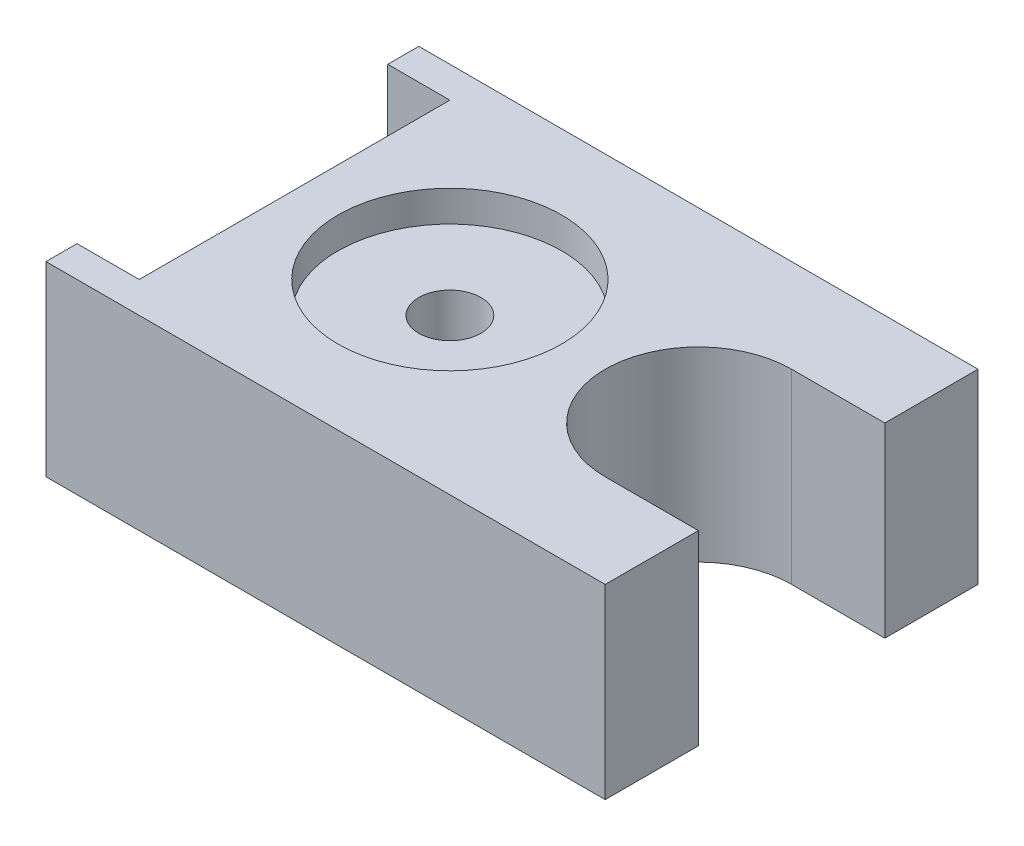
ISO-10303-21;
HEADER;
FILE_DESCRIPTION(('STEP AP214'),'2;1');
FILE_NAME('part.step','',(''),(''),'','','');
FILE_SCHEMA(('AUTOMOTIVE_DESIGN { 1 0 10303 214 1 1 1 1 }'));
ENDSEC;
DATA;
#1=APPLICATION_CONTEXT('core data for automotive mechanical design processes');
#2=APPLICATION_PROTOCOL_DEFINITION('international standard','automotive_design',2000,#1);
#3=PRODUCT_CONTEXT('',#1,'mechanical');
#4=PRODUCT('Part','Part','',(#3));
#5=PRODUCT_RELATED_PRODUCT_CATEGORY('part','',(#4));
#6=PRODUCT_DEFINITION_FORMATION('','',#4);
#7=PRODUCT_DEFINITION_CONTEXT('part definition',#1,'design');
#8=PRODUCT_DEFINITION('design','',#6,#7);
#9=PRODUCT_DEFINITION_SHAPE('','',#8);
#10=(LENGTH_UNIT() NAMED_UNIT(*) SI_UNIT(.MILLI.,.METRE.));
#11=(NAMED_UNIT(*) PLANE_ANGLE_UNIT() SI_UNIT($,.RADIAN.));
#12=(NAMED_UNIT(*) SI_UNIT($,.STERADIAN.) SOLID_ANGLE_UNIT());
#13=UNCERTAINTY_MEASURE_WITH_UNIT(LENGTH_MEASURE(1.E-05),#10,'distance_accuracy_value','');
#14=(GEOMETRIC_REPRESENTATION_CONTEXT(3) GLOBAL_UNCERTAINTY_ASSIGNED_CONTEXT((#13)) GLOBAL_UNIT_ASSIGNED_CONTEXT((#10,
#11,#12)) REPRESENTATION_CONTEXT('',''));
#15=CARTESIAN_POINT('',(0.,0.,0.));
#16=DIRECTION('',(0.,0.,1.));
#17=DIRECTION('',(1.,0.,0.));
#18=AXIS2_PLACEMENT_3D('',#15,#16,#17);
#19=CARTESIAN_POINT('',(35.,0.,-30.));
#20=DIRECTION('',(0.,1.,0.));
#21=DIRECTION('',(0.,0.,1.));
#22=AXIS2_PLACEMENT_3D('',#19,#20,#21);
#23=CYLINDRICAL_SURFACE('',#22,5.);
#24=CARTESIAN_POINT('',(35.,0.,-30.));
#25=DIRECTION('',(0.,1.,0.));
#26=DIRECTION('',(0.,0.,1.));
#27=AXIS2_PLACEMENT_3D('',#24,#25,#26);
#28=CIRCLE('',#27,5.);
#29=CARTESIAN_POINT('',(35.,0.,-25.));
#30=VERTEX_POINT('',#29);
#31=EDGE_CURVE('E232',#30,#30,#28,.T.);
#32=ORIENTED_EDGE('',*,*,#31,.F.);
#33=EDGE_LOOP('',(#32));
#34=FACE_BOUND('',#33,.T.);
#35=CARTESIAN_POINT('',(35.,25.,-30.));
#36=DIRECTION('',(0.,1.,0.));
#37=DIRECTION('',(0.,0.,1.));
#38=AXIS2_PLACEMENT_3D('',#35,#36,#37);
#39=CIRCLE('',#38,5.);
#40=CARTESIAN_POINT('',(35.,25.,-25.));
#41=VERTEX_POINT('',#40);
#42=EDGE_CURVE('E37',#41,#41,#39,.F.);
#43=ORIENTED_EDGE('',*,*,#42,.F.);
#44=EDGE_LOOP('',(#43));
#45=FACE_BOUND('',#44,.T.);
#46=ADVANCED_FACE('F33',(#34,#45),#23,.F.);
#47=CARTESIAN_POINT('',(0.,30.,-60.));
#48=DIRECTION('',(1.,0.,0.));
#49=DIRECTION('',(0.,0.,-1.));
#50=AXIS2_PLACEMENT_3D('',#47,#48,#49);
#51=PLANE('',#50);
#52=DIRECTION('',(0.,0.,1.));
#53=VECTOR('',#52,1.);
#54=CARTESIAN_POINT('',(0.,30.,-60.));
#55=LINE('',#54,#53);
#56=CARTESIAN_POINT('',(0.,30.,-5.));
#57=VERTEX_POINT('',#56);
#58=CARTESIAN_POINT('',(0.,30.,0.));
#59=VERTEX_POINT('',#58);
#60=EDGE_CURVE('E178',#57,#59,#55,.T.);
#61=ORIENTED_EDGE('',*,*,#60,.F.);
#62=DIRECTION('',(0.,1.,0.));
#63=VECTOR('',#62,1.);
#64=CARTESIAN_POINT('',(0.,0.,-5.));
#65=LINE('',#64,#63);
#66=CARTESIAN_POINT('',(0.,0.,-5.));
#67=VERTEX_POINT('',#66);
#68=EDGE_CURVE('E138',#67,#57,#65,.T.);
#69=ORIENTED_EDGE('',*,*,#68,.F.);
#70=DIRECTION('',(0.,0.,1.));
#71=VECTOR('',#70,1.);
#72=CARTESIAN_POINT('',(0.,0.,-60.));
#73=LINE('',#72,#71);
#74=CARTESIAN_POINT('',(0.,0.,0.));
#75=VERTEX_POINT('',#74);
#76=EDGE_CURVE('E170',#67,#75,#73,.T.);
#77=ORIENTED_EDGE('',*,*,#76,.T.);
#78=DIRECTION('',(0.,-1.,0.));
#79=VECTOR('',#78,1.);
#80=CARTESIAN_POINT('',(0.,30.,0.));
#81=LINE('',#80,#79);
#82=EDGE_CURVE('E11',#59,#75,#81,.T.);
#83=ORIENTED_EDGE('',*,*,#82,.F.);
#84=EDGE_LOOP('',(#61,#69,#77,#83));
#85=FACE_BOUND('',#84,.T.);
#86=ADVANCED_FACE('F224',(#85),#51,.F.);
#87=CARTESIAN_POINT('',(90.,30.,0.));
#88=DIRECTION('',(-1.,0.,0.));
#89=DIRECTION('',(0.,0.,1.));
#90=AXIS2_PLACEMENT_3D('',#87,#88,#89);
#91=PLANE('',#90);
#92=DIRECTION('',(0.,0.,-1.));
#93=VECTOR('',#92,1.);
#94=CARTESIAN_POINT('',(90.,0.,0.));
#95=LINE('',#94,#93);
#96=CARTESIAN_POINT('',(90.,0.,0.));
#97=VERTEX_POINT('',#96);
#98=CARTESIAN_POINT('',(90.,0.,-15.));
#99=VERTEX_POINT('',#98);
#100=EDGE_CURVE('E193',#97,#99,#95,.T.);
#101=ORIENTED_EDGE('',*,*,#100,.T.);
#102=DIRECTION('',(0.,1.,0.));
#103=VECTOR('',#102,1.);
#104=CARTESIAN_POINT('',(90.,0.,-15.));
#105=LINE('',#104,#103);
#106=CARTESIAN_POINT('',(90.,30.,-15.));
#107=VERTEX_POINT('',#106);
#108=EDGE_CURVE('E167',#99,#107,#105,.T.);
#109=ORIENTED_EDGE('',*,*,#108,.T.);
#110=DIRECTION('',(0.,0.,-1.));
#111=VECTOR('',#110,1.);
#112=CARTESIAN_POINT('',(90.,30.,0.));
#113=LINE('',#112,#111);
#114=CARTESIAN_POINT('',(90.,30.,0.));
#115=VERTEX_POINT('',#114);
#116=EDGE_CURVE('E181',#115,#107,#113,.T.);
#117=ORIENTED_EDGE('',*,*,#116,.F.);
#118=DIRECTION('',(0.,-1.,0.));
#119=VECTOR('',#118,1.);
#120=CARTESIAN_POINT('',(90.,30.,0.));
#121=LINE('',#120,#119);
#122=EDGE_CURVE('E42',#115,#97,#121,.T.);
#123=ORIENTED_EDGE('',*,*,#122,.T.);
#124=EDGE_LOOP('',(#101,#109,#117,#123));
#125=FACE_BOUND('',#124,.T.);
#126=ADVANCED_FACE('F208',(#125),#91,.F.);
#127=CARTESIAN_POINT('',(0.,0.,-60.));
#128=VERTEX_POINT('',#127);
#129=CARTESIAN_POINT('',(0.,0.,-55.));
#130=VERTEX_POINT('',#129);
#131=EDGE_CURVE('E187',#128,#130,#73,.T.);
#132=ORIENTED_EDGE('',*,*,#131,.T.);
#133=DIRECTION('',(0.,-1.,0.));
#134=VECTOR('',#133,1.);
#135=CARTESIAN_POINT('',(0.,30.,-55.));
#136=LINE('',#135,#134);
#137=CARTESIAN_POINT('',(0.,30.,-55.));
#138=VERTEX_POINT('',#137);
#139=EDGE_CURVE('E231',#138,#130,#136,.T.);
#140=ORIENTED_EDGE('',*,*,#139,.F.);
#141=CARTESIAN_POINT('',(0.,30.,-60.));
#142=VERTEX_POINT('',#141);
#143=EDGE_CURVE('E143',#142,#138,#55,.T.);
#144=ORIENTED_EDGE('',*,*,#143,.F.);
#145=DIRECTION('',(0.,-1.,0.));
#146=VECTOR('',#145,1.);
#147=CARTESIAN_POINT('',(0.,30.,-60.));
#148=LINE('',#147,#146);
#149=EDGE_CURVE('E186',#142,#128,#148,.T.);
#150=ORIENTED_EDGE('',*,*,#149,.T.);
#151=EDGE_LOOP('',(#132,#140,#144,#150));
#152=FACE_BOUND('',#151,.T.);
#153=ADVANCED_FACE('F35',(#152),#51,.F.);
#154=CARTESIAN_POINT('',(0.,30.,0.));
#155=DIRECTION('',(0.,0.,-1.));
#156=DIRECTION('',(-1.,0.,0.));
#157=AXIS2_PLACEMENT_3D('',#154,#155,#156);
#158=PLANE('',#157);
#159=DIRECTION('',(1.,0.,0.));
#160=VECTOR('',#159,1.);
#161=CARTESIAN_POINT('',(0.,0.,0.));
#162=LINE('',#161,#160);
#163=EDGE_CURVE('E190',#75,#97,#162,.T.);
#164=ORIENTED_EDGE('',*,*,#163,.T.);
#165=ORIENTED_EDGE('',*,*,#122,.F.);
#166=DIRECTION('',(1.,0.,0.));
#167=VECTOR('',#166,1.);
#168=CARTESIAN_POINT('',(0.,30.,0.));
#169=LINE('',#168,#167);
#170=EDGE_CURVE('E177',#59,#115,#169,.T.);
#171=ORIENTED_EDGE('',*,*,#170,.F.);
#172=ORIENTED_EDGE('',*,*,#82,.T.);
#173=EDGE_LOOP('',(#164,#165,#171,#172));
#174=FACE_BOUND('',#173,.T.);
#175=ADVANCED_FACE('F222',(#174),#158,.F.);
#176=CARTESIAN_POINT('',(90.,30.,-45.));
#177=VERTEX_POINT('',#176);
#178=CARTESIAN_POINT('',(90.,30.,-60.));
#179=VERTEX_POINT('',#178);
#180=EDGE_CURVE('E180',#177,#179,#113,.T.);
#181=ORIENTED_EDGE('',*,*,#180,.F.);
#182=DIRECTION('',(0.,1.,0.));
#183=VECTOR('',#182,1.);
#184=CARTESIAN_POINT('',(90.,0.,-45.));
#185=LINE('',#184,#183);
#186=CARTESIAN_POINT('',(90.,0.,-45.));
#187=VERTEX_POINT('',#186);
#188=EDGE_CURVE('E158',#187,#177,#185,.T.);
#189=ORIENTED_EDGE('',*,*,#188,.F.);
#190=CARTESIAN_POINT('',(90.,0.,-60.));
#191=VERTEX_POINT('',#190);
#192=EDGE_CURVE('E192',#187,#191,#95,.T.);
#193=ORIENTED_EDGE('',*,*,#192,.T.);
#194=DIRECTION('',(0.,-1.,0.));
#195=VECTOR('',#194,1.);
#196=CARTESIAN_POINT('',(90.,30.,-60.));
#197=LINE('',#196,#195);
#198=EDGE_CURVE('E200',#179,#191,#197,.T.);
#199=ORIENTED_EDGE('',*,*,#198,.F.);
#200=EDGE_LOOP('',(#181,#189,#193,#199));
#201=FACE_BOUND('',#200,.T.);
#202=ADVANCED_FACE('F285',(#201),#91,.F.);
#203=CARTESIAN_POINT('',(90.,30.,-60.));
#204=DIRECTION('',(0.,0.,1.));
#205=DIRECTION('',(1.,0.,0.));
#206=AXIS2_PLACEMENT_3D('',#203,#204,#205);
#207=PLANE('',#206);
#208=DIRECTION('',(-1.,0.,0.));
#209=VECTOR('',#208,1.);
#210=CARTESIAN_POINT('',(90.,0.,-60.));
#211=LINE('',#210,#209);
#212=EDGE_CURVE('E196',#191,#128,#211,.T.);
#213=ORIENTED_EDGE('',*,*,#212,.T.);
#214=ORIENTED_EDGE('',*,*,#149,.F.);
#215=DIRECTION('',(-1.,0.,0.));
#216=VECTOR('',#215,1.);
#217=CARTESIAN_POINT('',(90.,30.,-60.));
#218=LINE('',#217,#216);
#219=EDGE_CURVE('E184',#179,#142,#218,.T.);
#220=ORIENTED_EDGE('',*,*,#219,.F.);
#221=ORIENTED_EDGE('',*,*,#198,.T.);
#222=EDGE_LOOP('',(#213,#214,#220,#221));
#223=FACE_BOUND('',#222,.T.);
#224=ADVANCED_FACE('F278',(#223),#207,.F.);
#225=CARTESIAN_POINT('',(0.,30.,0.));
#226=DIRECTION('',(0.,1.,0.));
#227=DIRECTION('',(0.,0.,1.));
#228=AXIS2_PLACEMENT_3D('',#225,#226,#227);
#229=PLANE('',#228);
#230=CARTESIAN_POINT('',(35.,30.,-30.));
#231=DIRECTION('',(0.,1.,0.));
#232=DIRECTION('',(0.,0.,1.));
#233=AXIS2_PLACEMENT_3D('',#230,#231,#232);
#234=CIRCLE('',#233,18.);
#235=CARTESIAN_POINT('',(35.,30.,-12.));
#236=VERTEX_POINT('',#235);
#237=EDGE_CURVE('E237',#236,#236,#234,.T.);
#238=ORIENTED_EDGE('',*,*,#237,.F.);
#239=EDGE_LOOP('',(#238));
#240=FACE_BOUND('',#239,.T.);
#241=DIRECTION('',(-1.,0.,0.));
#242=VECTOR('',#241,1.);
#243=CARTESIAN_POINT('',(9.99999999999999,30.,-5.));
#244=LINE('',#243,#242);
#245=CARTESIAN_POINT('',(9.99999999999999,30.,-5.));
#246=VERTEX_POINT('',#245);
#247=EDGE_CURVE('E163',#246,#57,#244,.T.);
#248=ORIENTED_EDGE('',*,*,#247,.T.);
#249=ORIENTED_EDGE('',*,*,#60,.T.);
#250=ORIENTED_EDGE('',*,*,#170,.T.);
#251=ORIENTED_EDGE('',*,*,#116,.T.);
#252=DIRECTION('',(1.,0.,0.));
#253=VECTOR('',#252,1.);
#254=CARTESIAN_POINT('',(75.,30.,-15.));
#255=LINE('',#254,#253);
#256=CARTESIAN_POINT('',(75.,30.,-15.));
#257=VERTEX_POINT('',#256);
#258=EDGE_CURVE('E153',#257,#107,#255,.T.);
#259=ORIENTED_EDGE('',*,*,#258,.F.);
#260=CARTESIAN_POINT('',(75.,30.,-30.));
#261=DIRECTION('',(0.,1.,0.));
#262=DIRECTION('',(0.,0.,1.));
#263=AXIS2_PLACEMENT_3D('',#260,#261,#262);
#264=CIRCLE('',#263,15.);
#265=CARTESIAN_POINT('',(75.,30.,-45.));
#266=VERTEX_POINT('',#265);
#267=EDGE_CURVE('E162',#266,#257,#264,.T.);
#268=ORIENTED_EDGE('',*,*,#267,.F.);
#269=DIRECTION('',(-1.,0.,0.));
#270=VECTOR('',#269,1.);
#271=CARTESIAN_POINT('',(90.,30.,-45.));
#272=LINE('',#271,#270);
#273=EDGE_CURVE('E159',#177,#266,#272,.T.);
#274=ORIENTED_EDGE('',*,*,#273,.F.);
#275=ORIENTED_EDGE('',*,*,#180,.T.);
#276=ORIENTED_EDGE('',*,*,#219,.T.);
#277=ORIENTED_EDGE('',*,*,#143,.T.);
#278=DIRECTION('',(-1.,0.,0.));
#279=VECTOR('',#278,1.);
#280=CARTESIAN_POINT('',(9.99999999999999,30.,-55.));
#281=LINE('',#280,#279);
#282=CARTESIAN_POINT('',(9.99999999999999,30.,-55.));
#283=VERTEX_POINT('',#282);
#284=EDGE_CURVE('E123',#283,#138,#281,.T.);
#285=ORIENTED_EDGE('',*,*,#284,.F.);
#286=DIRECTION('',(0.,0.,-1.));
#287=VECTOR('',#286,1.);
#288=CARTESIAN_POINT('',(9.99999999999999,30.,-5.));
#289=LINE('',#288,#287);
#290=EDGE_CURVE('E129',#246,#283,#289,.T.);
#291=ORIENTED_EDGE('',*,*,#290,.F.);
#292=EDGE_LOOP('',(#248,#249,#250,#251,#259,#268,#274,#275,#276,#277,#285,#291));
#293=FACE_BOUND('',#292,.T.);
#294=ADVANCED_FACE('F141',(#240,#293),#229,.T.);
#295=CARTESIAN_POINT('',(0.,0.,0.));
#296=DIRECTION('',(0.,1.,0.));
#297=DIRECTION('',(0.,0.,1.));
#298=AXIS2_PLACEMENT_3D('',#295,#296,#297);
#299=PLANE('',#298);
#300=ORIENTED_EDGE('',*,*,#31,.T.);
#301=EDGE_LOOP('',(#300));
#302=FACE_BOUND('',#301,.T.);
#303=ORIENTED_EDGE('',*,*,#76,.F.);
#304=DIRECTION('',(-1.,0.,0.));
#305=VECTOR('',#304,1.);
#306=CARTESIAN_POINT('',(9.99999999999999,0.,-5.));
#307=LINE('',#306,#305);
#308=CARTESIAN_POINT('',(9.99999999999999,0.,-5.));
#309=VERTEX_POINT('',#308);
#310=EDGE_CURVE('E145',#309,#67,#307,.T.);
#311=ORIENTED_EDGE('',*,*,#310,.F.);
#312=DIRECTION('',(0.,0.,1.));
#313=VECTOR('',#312,1.);
#314=CARTESIAN_POINT('',(9.99999999999999,0.,-55.));
#315=LINE('',#314,#313);
#316=CARTESIAN_POINT('',(9.99999999999999,0.,-55.));
#317=VERTEX_POINT('',#316);
#318=EDGE_CURVE('E128',#317,#309,#315,.T.);
#319=ORIENTED_EDGE('',*,*,#318,.F.);
#320=DIRECTION('',(-1.,0.,0.));
#321=VECTOR('',#320,1.);
#322=CARTESIAN_POINT('',(9.99999999999999,0.,-55.));
#323=LINE('',#322,#321);
#324=EDGE_CURVE('E126',#317,#130,#323,.T.);
#325=ORIENTED_EDGE('',*,*,#324,.T.);
#326=ORIENTED_EDGE('',*,*,#131,.F.);
#327=ORIENTED_EDGE('',*,*,#212,.F.);
#328=ORIENTED_EDGE('',*,*,#192,.F.);
#329=DIRECTION('',(-1.,0.,0.));
#330=VECTOR('',#329,1.);
#331=CARTESIAN_POINT('',(90.,0.,-45.));
#332=LINE('',#331,#330);
#333=CARTESIAN_POINT('',(75.,0.,-45.));
#334=VERTEX_POINT('',#333);
#335=EDGE_CURVE('E150',#187,#334,#332,.T.);
#336=ORIENTED_EDGE('',*,*,#335,.T.);
#337=CARTESIAN_POINT('',(75.,0.,-30.));
#338=DIRECTION('',(0.,1.,0.));
#339=DIRECTION('',(0.,0.,1.));
#340=AXIS2_PLACEMENT_3D('',#337,#338,#339);
#341=CIRCLE('',#340,15.);
#342=CARTESIAN_POINT('',(75.,0.,-15.));
#343=VERTEX_POINT('',#342);
#344=EDGE_CURVE('E57',#334,#343,#341,.T.);
#345=ORIENTED_EDGE('',*,*,#344,.T.);
#346=DIRECTION('',(1.,0.,0.));
#347=VECTOR('',#346,1.);
#348=CARTESIAN_POINT('',(75.,0.,-15.));
#349=LINE('',#348,#347);
#350=EDGE_CURVE('E155',#343,#99,#349,.T.);
#351=ORIENTED_EDGE('',*,*,#350,.T.);
#352=ORIENTED_EDGE('',*,*,#100,.F.);
#353=ORIENTED_EDGE('',*,*,#163,.F.);
#354=EDGE_LOOP('',(#303,#311,#319,#325,#326,#327,#328,#336,#345,#351,#352,#353));
#355=FACE_BOUND('',#354,.T.);
#356=ADVANCED_FACE('F214',(#302,#355),#299,.F.);
#357=CARTESIAN_POINT('',(75.,0.,-15.));
#358=DIRECTION('',(0.,0.,1.));
#359=DIRECTION('',(1.,0.,0.));
#360=AXIS2_PLACEMENT_3D('',#357,#358,#359);
#361=PLANE('',#360);
#362=ORIENTED_EDGE('',*,*,#258,.T.);
#363=ORIENTED_EDGE('',*,*,#108,.F.);
#364=ORIENTED_EDGE('',*,*,#350,.F.);
#365=DIRECTION('',(0.,1.,0.));
#366=VECTOR('',#365,1.);
#367=CARTESIAN_POINT('',(75.,0.,-15.));
#368=LINE('',#367,#366);
#369=EDGE_CURVE('E171',#343,#257,#368,.T.);
#370=ORIENTED_EDGE('',*,*,#369,.T.);
#371=EDGE_LOOP('',(#362,#363,#364,#370));
#372=FACE_BOUND('',#371,.T.);
#373=ADVANCED_FACE('F217',(#372),#361,.F.);
#374=CARTESIAN_POINT('',(75.,0.,-30.));
#375=DIRECTION('',(0.,1.,0.));
#376=DIRECTION('',(0.,0.,1.));
#377=AXIS2_PLACEMENT_3D('',#374,#375,#376);
#378=CYLINDRICAL_SURFACE('',#377,15.);
#379=ORIENTED_EDGE('',*,*,#267,.T.);
#380=ORIENTED_EDGE('',*,*,#369,.F.);
#381=ORIENTED_EDGE('',*,*,#344,.F.);
#382=DIRECTION('',(0.,1.,0.));
#383=VECTOR('',#382,1.);
#384=CARTESIAN_POINT('',(75.,0.,-45.));
#385=LINE('',#384,#383);
#386=EDGE_CURVE('E173',#334,#266,#385,.T.);
#387=ORIENTED_EDGE('',*,*,#386,.T.);
#388=EDGE_LOOP('',(#379,#380,#381,#387));
#389=FACE_BOUND('',#388,.T.);
#390=ADVANCED_FACE('F270',(#389),#378,.F.);
#391=CARTESIAN_POINT('',(90.,0.,-45.));
#392=DIRECTION('',(0.,0.,-1.));
#393=DIRECTION('',(-1.,0.,0.));
#394=AXIS2_PLACEMENT_3D('',#391,#392,#393);
#395=PLANE('',#394);
#396=ORIENTED_EDGE('',*,*,#273,.T.);
#397=ORIENTED_EDGE('',*,*,#386,.F.);
#398=ORIENTED_EDGE('',*,*,#335,.F.);
#399=ORIENTED_EDGE('',*,*,#188,.T.);
#400=EDGE_LOOP('',(#396,#397,#398,#399));
#401=FACE_BOUND('',#400,.T.);
#402=ADVANCED_FACE('F265',(#401),#395,.F.);
#403=CARTESIAN_POINT('',(9.99999999999999,0.,-5.));
#404=DIRECTION('',(0.,0.,1.));
#405=DIRECTION('',(1.,0.,0.));
#406=AXIS2_PLACEMENT_3D('',#403,#404,#405);
#407=PLANE('',#406);
#408=ORIENTED_EDGE('',*,*,#68,.T.);
#409=ORIENTED_EDGE('',*,*,#247,.F.);
#410=DIRECTION('',(0.,1.,0.));
#411=VECTOR('',#410,1.);
#412=CARTESIAN_POINT('',(9.99999999999999,0.,-5.));
#413=LINE('',#412,#411);
#414=EDGE_CURVE('E135',#309,#246,#413,.T.);
#415=ORIENTED_EDGE('',*,*,#414,.F.);
#416=ORIENTED_EDGE('',*,*,#310,.T.);
#417=EDGE_LOOP('',(#408,#409,#415,#416));
#418=FACE_BOUND('',#417,.T.);
#419=ADVANCED_FACE('F262',(#418),#407,.F.);
#420=CARTESIAN_POINT('',(9.99999999999999,30.,-55.));
#421=DIRECTION('',(0.,0.,-1.));
#422=DIRECTION('',(0.,1.,0.));
#423=AXIS2_PLACEMENT_3D('',#420,#421,#422);
#424=PLANE('',#423);
#425=ORIENTED_EDGE('',*,*,#139,.T.);
#426=ORIENTED_EDGE('',*,*,#324,.F.);
#427=DIRECTION('',(0.,-1.,0.));
#428=VECTOR('',#427,1.);
#429=CARTESIAN_POINT('',(9.99999999999999,30.,-55.));
#430=LINE('',#429,#428);
#431=EDGE_CURVE('E49',#283,#317,#430,.T.);
#432=ORIENTED_EDGE('',*,*,#431,.F.);
#433=ORIENTED_EDGE('',*,*,#284,.T.);
#434=EDGE_LOOP('',(#425,#426,#432,#433));
#435=FACE_BOUND('',#434,.T.);
#436=ADVANCED_FACE('F121',(#435),#424,.F.);
#437=CARTESIAN_POINT('',(9.99999999999999,0.,0.));
#438=DIRECTION('',(-1.,0.,0.));
#439=DIRECTION('',(0.,0.,1.));
#440=AXIS2_PLACEMENT_3D('',#437,#438,#439);
#441=PLANE('',#440);
#442=ORIENTED_EDGE('',*,*,#290,.T.);
#443=ORIENTED_EDGE('',*,*,#431,.T.);
#444=ORIENTED_EDGE('',*,*,#318,.T.);
#445=ORIENTED_EDGE('',*,*,#414,.T.);
#446=EDGE_LOOP('',(#442,#443,#444,#445));
#447=FACE_BOUND('',#446,.T.);
#448=ADVANCED_FACE('F133',(#447),#441,.T.);
#449=CARTESIAN_POINT('',(35.,25.,-30.));
#450=DIRECTION('',(0.,1.,0.));
#451=DIRECTION('',(0.,0.,1.));
#452=AXIS2_PLACEMENT_3D('',#449,#450,#451);
#453=PLANE('',#452);
#454=CARTESIAN_POINT('',(35.,25.,-30.));
#455=DIRECTION('',(0.,1.,0.));
#456=DIRECTION('',(0.,0.,1.));
#457=AXIS2_PLACEMENT_3D('',#454,#455,#456);
#458=CIRCLE('',#457,18.);
#459=CARTESIAN_POINT('',(35.,25.,-12.));
#460=VERTEX_POINT('',#459);
#461=EDGE_CURVE('E240',#460,#460,#458,.T.);
#462=ORIENTED_EDGE('',*,*,#461,.T.);
#463=EDGE_LOOP('',(#462));
#464=FACE_BOUND('',#463,.T.);
#465=ORIENTED_EDGE('',*,*,#42,.T.);
#466=EDGE_LOOP('',(#465));
#467=FACE_BOUND('',#466,.T.);
#468=ADVANCED_FACE('F247',(#464,#467),#453,.T.);
#469=CARTESIAN_POINT('',(35.,25.,-30.));
#470=DIRECTION('',(0.,1.,0.));
#471=DIRECTION('',(0.,0.,1.));
#472=AXIS2_PLACEMENT_3D('',#469,#470,#471);
#473=CYLINDRICAL_SURFACE('',#472,18.);
#474=ORIENTED_EDGE('',*,*,#461,.F.);
#475=EDGE_LOOP('',(#474));
#476=FACE_BOUND('',#475,.T.);
#477=ORIENTED_EDGE('',*,*,#237,.T.);
#478=EDGE_LOOP('',(#477));
#479=FACE_BOUND('',#478,.T.);
#480=ADVANCED_FACE('F258',(#476,#479),#473,.F.);
#481=CLOSED_SHELL('',(#46,#86,#126,#153,#175,#202,#224,#294,#356,#373,#390,#402,#419,#436,#448,
#468,#480));
#482=MANIFOLD_SOLID_BREP('B2',#481);
#483=ADVANCED_BREP_SHAPE_REPRESENTATION('',(#18,#482),#14);
#484=SHAPE_DEFINITION_REPRESENTATION(#9,#483);
ENDSEC;
END-ISO-10303-21;
